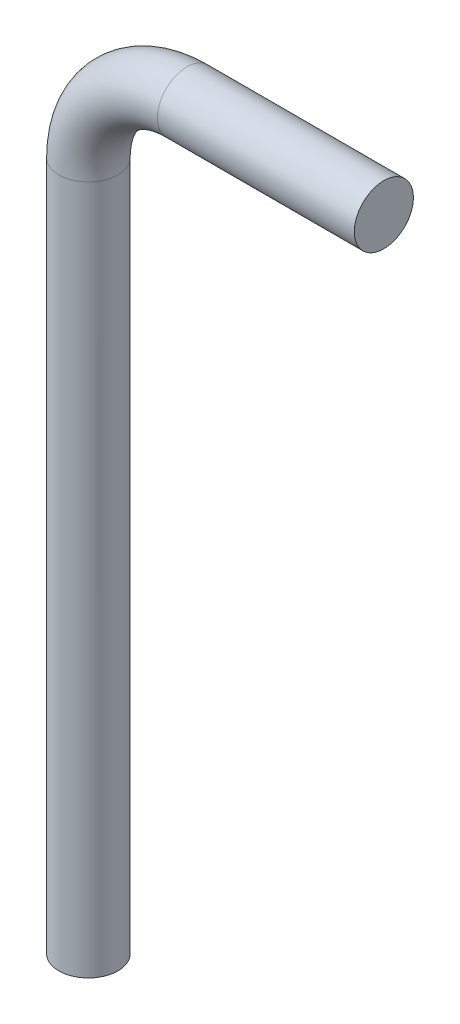
ISO-10303-21;
HEADER;
FILE_DESCRIPTION(('STEP AP214'),'2;1');
FILE_NAME('part.step','',(''),(''),'','','');
FILE_SCHEMA(('AUTOMOTIVE_DESIGN { 1 0 10303 214 1 1 1 1 }'));
ENDSEC;
DATA;
#1=APPLICATION_CONTEXT('core data for automotive mechanical design processes');
#2=APPLICATION_PROTOCOL_DEFINITION('international standard','automotive_design',2000,#1);
#3=PRODUCT_CONTEXT('',#1,'mechanical');
#4=PRODUCT('Part','Part','',(#3));
#5=PRODUCT_RELATED_PRODUCT_CATEGORY('part','',(#4));
#6=PRODUCT_DEFINITION_FORMATION('','',#4);
#7=PRODUCT_DEFINITION_CONTEXT('part definition',#1,'design');
#8=PRODUCT_DEFINITION('design','',#6,#7);
#9=PRODUCT_DEFINITION_SHAPE('','',#8);
#10=(LENGTH_UNIT() NAMED_UNIT(*) SI_UNIT(.MILLI.,.METRE.));
#11=(NAMED_UNIT(*) PLANE_ANGLE_UNIT() SI_UNIT($,.RADIAN.));
#12=(NAMED_UNIT(*) SI_UNIT($,.STERADIAN.) SOLID_ANGLE_UNIT());
#13=UNCERTAINTY_MEASURE_WITH_UNIT(LENGTH_MEASURE(1.E-05),#10,'distance_accuracy_value','');
#14=(GEOMETRIC_REPRESENTATION_CONTEXT(3) GLOBAL_UNCERTAINTY_ASSIGNED_CONTEXT((#13)) GLOBAL_UNIT_ASSIGNED_CONTEXT((#10,
#11,#12)) REPRESENTATION_CONTEXT('',''));
#15=CARTESIAN_POINT('',(0.,0.,0.));
#16=DIRECTION('',(0.,0.,1.));
#17=DIRECTION('',(1.,0.,0.));
#18=AXIS2_PLACEMENT_3D('',#15,#16,#17);
#19=CARTESIAN_POINT('',(0.,70.,0.));
#20=DIRECTION('',(0.,-1.,0.));
#21=DIRECTION('',(0.,0.,-1.));
#22=AXIS2_PLACEMENT_3D('',#19,#20,#21);
#23=CYLINDRICAL_SURFACE('',#22,3.);
#24=CARTESIAN_POINT('',(0.,70.,0.));
#25=DIRECTION('',(0.,1.,0.));
#26=DIRECTION('',(0.,0.,-1.));
#27=AXIS2_PLACEMENT_3D('',#24,#25,#26);
#28=CIRCLE('',#27,3.);
#29=CARTESIAN_POINT('',(-3.,70.,0.));
#30=VERTEX_POINT('',#29);
#31=EDGE_CURVE('E36',#30,#30,#28,.T.);
#32=ORIENTED_EDGE('',*,*,#31,.F.);
#33=EDGE_LOOP('',(#32));
#34=FACE_BOUND('',#33,.T.);
#35=CARTESIAN_POINT('',(0.,0.,0.));
#36=DIRECTION('',(0.,1.,0.));
#37=DIRECTION('',(0.,0.,-1.));
#38=AXIS2_PLACEMENT_3D('',#35,#36,#37);
#39=CIRCLE('',#38,3.);
#40=CARTESIAN_POINT('',(0.,0.,-3.));
#41=VERTEX_POINT('',#40);
#42=EDGE_CURVE('E10',#41,#41,#39,.T.);
#43=ORIENTED_EDGE('',*,*,#42,.T.);
#44=EDGE_LOOP('',(#43));
#45=FACE_BOUND('',#44,.T.);
#46=ADVANCED_FACE('F30',(#34,#45),#23,.T.);
#47=CARTESIAN_POINT('',(10.,70.,0.));
#48=DIRECTION('',(0.,0.,1.));
#49=DIRECTION('',(1.,0.,0.));
#50=AXIS2_PLACEMENT_3D('',#47,#48,#49);
#51=TOROIDAL_SURFACE('',#50,9.99999999999999,3.);
#52=CARTESIAN_POINT('',(10.,80.,0.));
#53=DIRECTION('',(1.,0.,0.));
#54=DIRECTION('',(0.,0.,-1.));
#55=AXIS2_PLACEMENT_3D('',#52,#53,#54);
#56=CIRCLE('',#55,3.);
#57=CARTESIAN_POINT('',(10.,83.,0.));
#58=VERTEX_POINT('',#57);
#59=EDGE_CURVE('E40',#58,#58,#56,.T.);
#60=CARTESIAN_POINT('',(10.,70.,0.));
#61=DIRECTION('',(0.,0.,1.));
#62=DIRECTION('',(1.,0.,0.));
#63=AXIS2_PLACEMENT_3D('',#60,#61,#62);
#64=CIRCLE('',#63,13.);
#65=EDGE_CURVE('',#58,#30,#64,.T.);
#66=ORIENTED_EDGE('',*,*,#59,.F.);
#67=ORIENTED_EDGE('',*,*,#31,.T.);
#68=ORIENTED_EDGE('',*,*,#65,.T.);
#69=ORIENTED_EDGE('',*,*,#65,.F.);
#70=EDGE_LOOP('',(#66,#68,#67,#69));
#71=FACE_BOUND('',#70,.T.);
#72=ADVANCED_FACE('F55',(#71),#51,.T.);
#73=CARTESIAN_POINT('',(10.,80.,0.));
#74=DIRECTION('',(1.,0.,0.));
#75=DIRECTION('',(0.,0.,-1.));
#76=AXIS2_PLACEMENT_3D('',#73,#74,#75);
#77=CYLINDRICAL_SURFACE('',#76,3.);
#78=ORIENTED_EDGE('',*,*,#59,.T.);
#79=EDGE_LOOP('',(#78));
#80=FACE_BOUND('',#79,.T.);
#81=CARTESIAN_POINT('',(30.,80.,0.));
#82=DIRECTION('',(1.,0.,0.));
#83=DIRECTION('',(0.,0.,-1.));
#84=AXIS2_PLACEMENT_3D('',#81,#82,#83);
#85=CIRCLE('',#84,3.);
#86=CARTESIAN_POINT('',(30.,80.,-3.));
#87=VERTEX_POINT('',#86);
#88=EDGE_CURVE('E44',#87,#87,#85,.T.);
#89=ORIENTED_EDGE('',*,*,#88,.F.);
#90=EDGE_LOOP('',(#89));
#91=FACE_BOUND('',#90,.T.);
#92=ADVANCED_FACE('F52',(#80,#91),#77,.T.);
#93=CARTESIAN_POINT('',(0.,0.,0.));
#94=DIRECTION('',(0.,1.,0.));
#95=DIRECTION('',(0.,0.,-1.));
#96=AXIS2_PLACEMENT_3D('',#93,#94,#95);
#97=PLANE('',#96);
#98=ORIENTED_EDGE('',*,*,#42,.F.);
#99=EDGE_LOOP('',(#98));
#100=FACE_BOUND('',#99,.T.);
#101=ADVANCED_FACE('F54',(#100),#97,.F.);
#102=CARTESIAN_POINT('',(30.,80.,0.));
#103=DIRECTION('',(1.,0.,0.));
#104=DIRECTION('',(0.,0.,-1.));
#105=AXIS2_PLACEMENT_3D('',#102,#103,#104);
#106=PLANE('',#105);
#107=ORIENTED_EDGE('',*,*,#88,.T.);
#108=EDGE_LOOP('',(#107));
#109=FACE_BOUND('',#108,.T.);
#110=ADVANCED_FACE('F50',(#109),#106,.T.);
#111=CLOSED_SHELL('',(#46,#72,#92,#101,#110));
#112=MANIFOLD_SOLID_BREP('B2',#111);
#113=ADVANCED_BREP_SHAPE_REPRESENTATION('',(#18,#112),#14);
#114=SHAPE_DEFINITION_REPRESENTATION(#9,#113);
ENDSEC;
END-ISO-10303-21;
